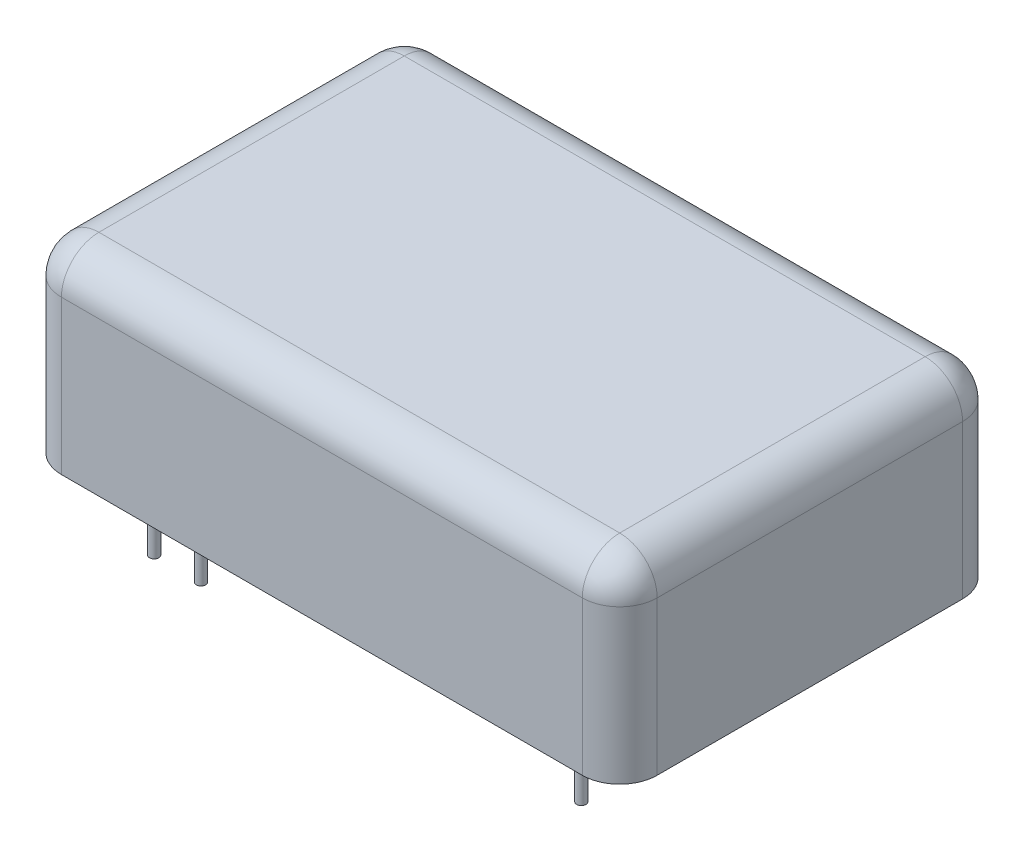
ISO-10303-21;
HEADER;
FILE_DESCRIPTION(('STEP AP214'),'2;1');
FILE_NAME('part.step','',(''),(''),'','','');
FILE_SCHEMA(('AUTOMOTIVE_DESIGN { 1 0 10303 214 1 1 1 1 }'));
ENDSEC;
DATA;
#1=APPLICATION_CONTEXT('core data for automotive mechanical design processes');
#2=APPLICATION_PROTOCOL_DEFINITION('international standard','automotive_design',2000,#1);
#3=PRODUCT_CONTEXT('',#1,'mechanical');
#4=PRODUCT('Part','Part','',(#3));
#5=PRODUCT_RELATED_PRODUCT_CATEGORY('part','',(#4));
#6=PRODUCT_DEFINITION_FORMATION('','',#4);
#7=PRODUCT_DEFINITION_CONTEXT('part definition',#1,'design');
#8=PRODUCT_DEFINITION('design','',#6,#7);
#9=PRODUCT_DEFINITION_SHAPE('','',#8);
#10=(LENGTH_UNIT() NAMED_UNIT(*) SI_UNIT(.MILLI.,.METRE.));
#11=(NAMED_UNIT(*) PLANE_ANGLE_UNIT() SI_UNIT($,.RADIAN.));
#12=(NAMED_UNIT(*) SI_UNIT($,.STERADIAN.) SOLID_ANGLE_UNIT());
#13=UNCERTAINTY_MEASURE_WITH_UNIT(LENGTH_MEASURE(1.E-05),#10,'distance_accuracy_value','');
#14=(GEOMETRIC_REPRESENTATION_CONTEXT(3) GLOBAL_UNCERTAINTY_ASSIGNED_CONTEXT((#13)) GLOBAL_UNIT_ASSIGNED_CONTEXT((#10,
#11,#12)) REPRESENTATION_CONTEXT('',''));
#15=CARTESIAN_POINT('',(0.,0.,0.));
#16=DIRECTION('',(0.,0.,1.));
#17=DIRECTION('',(1.,0.,0.));
#18=AXIS2_PLACEMENT_3D('',#15,#16,#17);
#19=CARTESIAN_POINT('',(0.,0.,0.));
#20=DIRECTION('',(0.,1.,0.));
#21=DIRECTION('',(0.,0.,1.));
#22=AXIS2_PLACEMENT_3D('',#19,#20,#21);
#23=PLANE('',#22);
#24=DIRECTION('',(0.,0.,-1.));
#25=VECTOR('',#24,1.);
#26=CARTESIAN_POINT('',(15.9,0.,-10.15));
#27=LINE('',#26,#25);
#28=CARTESIAN_POINT('',(15.9,0.,8.15));
#29=VERTEX_POINT('',#28);
#30=CARTESIAN_POINT('',(15.9,0.,-8.15000000000001));
#31=VERTEX_POINT('',#30);
#32=EDGE_CURVE('E221',#29,#31,#27,.T.);
#33=ORIENTED_EDGE('',*,*,#32,.F.);
#34=CARTESIAN_POINT('',(13.9,0.,8.15));
#35=DIRECTION('',(0.,1.,0.));
#36=DIRECTION('',(0.,0.,1.));
#37=AXIS2_PLACEMENT_3D('',#34,#35,#36);
#38=CIRCLE('',#37,2.);
#39=CARTESIAN_POINT('',(13.9,0.,10.15));
#40=VERTEX_POINT('',#39);
#41=EDGE_CURVE('E11',#29,#40,#38,.F.);
#42=ORIENTED_EDGE('',*,*,#41,.T.);
#43=DIRECTION('',(1.,0.,0.));
#44=VECTOR('',#43,1.);
#45=CARTESIAN_POINT('',(-15.9,0.,10.15));
#46=LINE('',#45,#44);
#47=CARTESIAN_POINT('',(-13.9,0.,10.15));
#48=VERTEX_POINT('',#47);
#49=EDGE_CURVE('E229',#48,#40,#46,.T.);
#50=ORIENTED_EDGE('',*,*,#49,.F.);
#51=CARTESIAN_POINT('',(-13.9,0.,8.15));
#52=DIRECTION('',(0.,1.,0.));
#53=DIRECTION('',(0.,0.,1.));
#54=AXIS2_PLACEMENT_3D('',#51,#52,#53);
#55=CIRCLE('',#54,2.);
#56=CARTESIAN_POINT('',(-15.9,0.,8.15));
#57=VERTEX_POINT('',#56);
#58=EDGE_CURVE('E172',#48,#57,#55,.F.);
#59=ORIENTED_EDGE('',*,*,#58,.T.);
#60=DIRECTION('',(0.,0.,1.));
#61=VECTOR('',#60,1.);
#62=CARTESIAN_POINT('',(-15.9,0.,-10.15));
#63=LINE('',#62,#61);
#64=CARTESIAN_POINT('',(-15.9,0.,-8.15));
#65=VERTEX_POINT('',#64);
#66=EDGE_CURVE('E226',#65,#57,#63,.T.);
#67=ORIENTED_EDGE('',*,*,#66,.F.);
#68=CARTESIAN_POINT('',(-13.9,0.,-8.15000000000001));
#69=DIRECTION('',(0.,1.,0.));
#70=DIRECTION('',(0.,0.,1.));
#71=AXIS2_PLACEMENT_3D('',#68,#69,#70);
#72=CIRCLE('',#71,2.);
#73=CARTESIAN_POINT('',(-13.9,0.,-10.15));
#74=VERTEX_POINT('',#73);
#75=EDGE_CURVE('E174',#65,#74,#72,.F.);
#76=ORIENTED_EDGE('',*,*,#75,.T.);
#77=DIRECTION('',(-1.,0.,0.));
#78=VECTOR('',#77,1.);
#79=CARTESIAN_POINT('',(-15.9,0.,-10.15));
#80=LINE('',#79,#78);
#81=CARTESIAN_POINT('',(13.9,0.,-10.15));
#82=VERTEX_POINT('',#81);
#83=EDGE_CURVE('E223',#82,#74,#80,.T.);
#84=ORIENTED_EDGE('',*,*,#83,.F.);
#85=CARTESIAN_POINT('',(13.9,0.,-8.15000000000001));
#86=DIRECTION('',(0.,1.,0.));
#87=DIRECTION('',(0.,0.,1.));
#88=AXIS2_PLACEMENT_3D('',#85,#86,#87);
#89=CIRCLE('',#88,2.);
#90=EDGE_CURVE('E43',#82,#31,#89,.F.);
#91=ORIENTED_EDGE('',*,*,#90,.T.);
#92=EDGE_LOOP('',(#33,#42,#50,#59,#67,#76,#84,#91));
#93=FACE_BOUND('',#92,.T.);
#94=CARTESIAN_POINT('',(11.3,0.,7.6));
#95=DIRECTION('',(0.,1.,0.));
#96=DIRECTION('',(0.,0.,1.));
#97=AXIS2_PLACEMENT_3D('',#94,#95,#96);
#98=CIRCLE('',#97,0.25);
#99=CARTESIAN_POINT('',(11.3,0.,7.85));
#100=VERTEX_POINT('',#99);
#101=EDGE_CURVE('E232',#100,#100,#98,.F.);
#102=ORIENTED_EDGE('',*,*,#101,.F.);
#103=EDGE_LOOP('',(#102));
#104=FACE_BOUND('',#103,.T.);
#105=CARTESIAN_POINT('',(-11.5,0.,7.6));
#106=DIRECTION('',(0.,1.,0.));
#107=DIRECTION('',(0.,0.,1.));
#108=AXIS2_PLACEMENT_3D('',#105,#106,#107);
#109=CIRCLE('',#108,0.25);
#110=CARTESIAN_POINT('',(-11.5,0.,7.85));
#111=VERTEX_POINT('',#110);
#112=EDGE_CURVE('E235',#111,#111,#109,.F.);
#113=ORIENTED_EDGE('',*,*,#112,.F.);
#114=EDGE_LOOP('',(#113));
#115=FACE_BOUND('',#114,.T.);
#116=CARTESIAN_POINT('',(-9.00000000000001,0.,7.6));
#117=DIRECTION('',(0.,1.,0.));
#118=DIRECTION('',(0.,0.,1.));
#119=AXIS2_PLACEMENT_3D('',#116,#117,#118);
#120=CIRCLE('',#119,0.25);
#121=CARTESIAN_POINT('',(-9.00000000000001,0.,7.85));
#122=VERTEX_POINT('',#121);
#123=EDGE_CURVE('E238',#122,#122,#120,.F.);
#124=ORIENTED_EDGE('',*,*,#123,.F.);
#125=EDGE_LOOP('',(#124));
#126=FACE_BOUND('',#125,.T.);
#127=CARTESIAN_POINT('',(-9.00000000000001,0.,-7.60000000000001));
#128=DIRECTION('',(0.,1.,0.));
#129=DIRECTION('',(0.,0.,1.));
#130=AXIS2_PLACEMENT_3D('',#127,#128,#129);
#131=CIRCLE('',#130,0.25);
#132=CARTESIAN_POINT('',(-9.00000000000001,0.,-7.35000000000001));
#133=VERTEX_POINT('',#132);
#134=EDGE_CURVE('E241',#133,#133,#131,.F.);
#135=ORIENTED_EDGE('',*,*,#134,.F.);
#136=EDGE_LOOP('',(#135));
#137=FACE_BOUND('',#136,.T.);
#138=CARTESIAN_POINT('',(-11.5,0.,-7.60000000000001));
#139=DIRECTION('',(0.,1.,0.));
#140=DIRECTION('',(0.,0.,1.));
#141=AXIS2_PLACEMENT_3D('',#138,#139,#140);
#142=CIRCLE('',#141,0.25);
#143=CARTESIAN_POINT('',(-11.5,0.,-7.35000000000001));
#144=VERTEX_POINT('',#143);
#145=EDGE_CURVE('E244',#144,#144,#142,.F.);
#146=ORIENTED_EDGE('',*,*,#145,.F.);
#147=EDGE_LOOP('',(#146));
#148=FACE_BOUND('',#147,.T.);
#149=CARTESIAN_POINT('',(11.3,0.,-7.60000000000001));
#150=DIRECTION('',(0.,1.,0.));
#151=DIRECTION('',(0.,0.,1.));
#152=AXIS2_PLACEMENT_3D('',#149,#150,#151);
#153=CIRCLE('',#152,0.25);
#154=CARTESIAN_POINT('',(11.3,0.,-7.35000000000001));
#155=VERTEX_POINT('',#154);
#156=EDGE_CURVE('E141',#155,#155,#153,.F.);
#157=ORIENTED_EDGE('',*,*,#156,.F.);
#158=EDGE_LOOP('',(#157));
#159=FACE_BOUND('',#158,.T.);
#160=ADVANCED_FACE('F34',(#93,#104,#115,#126,#137,#148,#159),#23,.F.);
#161=CARTESIAN_POINT('',(15.9,10.2,-10.15));
#162=DIRECTION('',(-1.,0.,0.));
#163=DIRECTION('',(0.,0.,1.));
#164=AXIS2_PLACEMENT_3D('',#161,#162,#163);
#165=PLANE('',#164);
#166=DIRECTION('',(0.,0.,-1.));
#167=VECTOR('',#166,1.);
#168=CARTESIAN_POINT('',(15.9,8.2,10.15));
#169=LINE('',#168,#167);
#170=CARTESIAN_POINT('',(15.9,8.2,-8.15000000000001));
#171=VERTEX_POINT('',#170);
#172=CARTESIAN_POINT('',(15.9,8.2,8.15));
#173=VERTEX_POINT('',#172);
#174=EDGE_CURVE('E51',#171,#173,#169,.F.);
#175=ORIENTED_EDGE('',*,*,#174,.T.);
#176=DIRECTION('',(0.,-1.,0.));
#177=VECTOR('',#176,1.);
#178=CARTESIAN_POINT('',(15.9,10.2,8.15));
#179=LINE('',#178,#177);
#180=EDGE_CURVE('E170',#173,#29,#179,.T.);
#181=ORIENTED_EDGE('',*,*,#180,.T.);
#182=ORIENTED_EDGE('',*,*,#32,.T.);
#183=DIRECTION('',(0.,-1.,0.));
#184=VECTOR('',#183,1.);
#185=CARTESIAN_POINT('',(15.9,10.2,-8.15000000000001));
#186=LINE('',#185,#184);
#187=EDGE_CURVE('E56',#31,#171,#186,.F.);
#188=ORIENTED_EDGE('',*,*,#187,.T.);
#189=EDGE_LOOP('',(#175,#181,#182,#188));
#190=FACE_BOUND('',#189,.T.);
#191=ADVANCED_FACE('F273',(#190),#165,.F.);
#192=CARTESIAN_POINT('',(-15.9,10.2,-10.15));
#193=DIRECTION('',(0.,0.,1.));
#194=DIRECTION('',(1.,0.,0.));
#195=AXIS2_PLACEMENT_3D('',#192,#193,#194);
#196=PLANE('',#195);
#197=DIRECTION('',(-1.,0.,0.));
#198=VECTOR('',#197,1.);
#199=CARTESIAN_POINT('',(15.9,8.2,-10.15));
#200=LINE('',#199,#198);
#201=CARTESIAN_POINT('',(-13.9,8.2,-10.15));
#202=VERTEX_POINT('',#201);
#203=CARTESIAN_POINT('',(13.9,8.2,-10.15));
#204=VERTEX_POINT('',#203);
#205=EDGE_CURVE('E164',#202,#204,#200,.F.);
#206=ORIENTED_EDGE('',*,*,#205,.T.);
#207=DIRECTION('',(0.,-1.,0.));
#208=VECTOR('',#207,1.);
#209=CARTESIAN_POINT('',(13.9,10.2,-10.15));
#210=LINE('',#209,#208);
#211=EDGE_CURVE('E166',#204,#82,#210,.T.);
#212=ORIENTED_EDGE('',*,*,#211,.T.);
#213=ORIENTED_EDGE('',*,*,#83,.T.);
#214=DIRECTION('',(0.,-1.,0.));
#215=VECTOR('',#214,1.);
#216=CARTESIAN_POINT('',(-13.9,10.2,-10.15));
#217=LINE('',#216,#215);
#218=EDGE_CURVE('E162',#74,#202,#217,.F.);
#219=ORIENTED_EDGE('',*,*,#218,.T.);
#220=EDGE_LOOP('',(#206,#212,#213,#219));
#221=FACE_BOUND('',#220,.T.);
#222=ADVANCED_FACE('F296',(#221),#196,.F.);
#223=CARTESIAN_POINT('',(-15.9,10.2,-10.15));
#224=DIRECTION('',(1.,0.,0.));
#225=DIRECTION('',(0.,0.,-1.));
#226=AXIS2_PLACEMENT_3D('',#223,#224,#225);
#227=PLANE('',#226);
#228=DIRECTION('',(0.,0.,1.));
#229=VECTOR('',#228,1.);
#230=CARTESIAN_POINT('',(-15.9,8.2,-10.15));
#231=LINE('',#230,#229);
#232=CARTESIAN_POINT('',(-15.9,8.2,8.15));
#233=VERTEX_POINT('',#232);
#234=CARTESIAN_POINT('',(-15.9,8.2,-8.15));
#235=VERTEX_POINT('',#234);
#236=EDGE_CURVE('E158',#233,#235,#231,.F.);
#237=ORIENTED_EDGE('',*,*,#236,.T.);
#238=DIRECTION('',(0.,-1.,0.));
#239=VECTOR('',#238,1.);
#240=CARTESIAN_POINT('',(-15.9,10.2,-8.15));
#241=LINE('',#240,#239);
#242=EDGE_CURVE('E160',#235,#65,#241,.T.);
#243=ORIENTED_EDGE('',*,*,#242,.T.);
#244=ORIENTED_EDGE('',*,*,#66,.T.);
#245=DIRECTION('',(0.,-1.,0.));
#246=VECTOR('',#245,1.);
#247=CARTESIAN_POINT('',(-15.9,10.2,8.15));
#248=LINE('',#247,#246);
#249=EDGE_CURVE('E156',#57,#233,#248,.F.);
#250=ORIENTED_EDGE('',*,*,#249,.T.);
#251=EDGE_LOOP('',(#237,#243,#244,#250));
#252=FACE_BOUND('',#251,.T.);
#253=ADVANCED_FACE('F303',(#252),#227,.F.);
#254=CARTESIAN_POINT('',(-15.9,10.2,10.15));
#255=DIRECTION('',(0.,0.,-1.));
#256=DIRECTION('',(-1.,0.,0.));
#257=AXIS2_PLACEMENT_3D('',#254,#255,#256);
#258=PLANE('',#257);
#259=ORIENTED_EDGE('',*,*,#49,.T.);
#260=DIRECTION('',(0.,-1.,0.));
#261=VECTOR('',#260,1.);
#262=CARTESIAN_POINT('',(13.9,10.2,10.15));
#263=LINE('',#262,#261);
#264=CARTESIAN_POINT('',(13.9,8.2,10.15));
#265=VERTEX_POINT('',#264);
#266=EDGE_CURVE('E154',#40,#265,#263,.F.);
#267=ORIENTED_EDGE('',*,*,#266,.T.);
#268=DIRECTION('',(1.,0.,0.));
#269=VECTOR('',#268,1.);
#270=CARTESIAN_POINT('',(-15.9,8.2,10.15));
#271=LINE('',#270,#269);
#272=CARTESIAN_POINT('',(-13.9,8.2,10.15));
#273=VERTEX_POINT('',#272);
#274=EDGE_CURVE('E119',#265,#273,#271,.F.);
#275=ORIENTED_EDGE('',*,*,#274,.T.);
#276=DIRECTION('',(0.,-1.,0.));
#277=VECTOR('',#276,1.);
#278=CARTESIAN_POINT('',(-13.9,10.2,10.15));
#279=LINE('',#278,#277);
#280=EDGE_CURVE('E147',#273,#48,#279,.T.);
#281=ORIENTED_EDGE('',*,*,#280,.T.);
#282=EDGE_LOOP('',(#259,#267,#275,#281));
#283=FACE_BOUND('',#282,.T.);
#284=ADVANCED_FACE('F267',(#283),#258,.F.);
#285=CARTESIAN_POINT('',(0.,10.2,0.));
#286=DIRECTION('',(0.,1.,0.));
#287=DIRECTION('',(0.,0.,1.));
#288=AXIS2_PLACEMENT_3D('',#285,#286,#287);
#289=PLANE('',#288);
#290=DIRECTION('',(0.,0.,1.));
#291=VECTOR('',#290,1.);
#292=CARTESIAN_POINT('',(-13.9,10.2,10.15));
#293=LINE('',#292,#291);
#294=CARTESIAN_POINT('',(-13.9,10.2,-8.15000000000001));
#295=VERTEX_POINT('',#294);
#296=CARTESIAN_POINT('',(-13.9,10.2,8.15));
#297=VERTEX_POINT('',#296);
#298=EDGE_CURVE('E145',#295,#297,#293,.T.);
#299=ORIENTED_EDGE('',*,*,#298,.T.);
#300=DIRECTION('',(1.,0.,0.));
#301=VECTOR('',#300,1.);
#302=CARTESIAN_POINT('',(15.9,10.2,8.15));
#303=LINE('',#302,#301);
#304=CARTESIAN_POINT('',(13.9,10.2,8.15));
#305=VERTEX_POINT('',#304);
#306=EDGE_CURVE('E117',#297,#305,#303,.T.);
#307=ORIENTED_EDGE('',*,*,#306,.T.);
#308=DIRECTION('',(0.,0.,-1.));
#309=VECTOR('',#308,1.);
#310=CARTESIAN_POINT('',(13.9,10.2,-10.15));
#311=LINE('',#310,#309);
#312=CARTESIAN_POINT('',(13.9,10.2,-8.15000000000001));
#313=VERTEX_POINT('',#312);
#314=EDGE_CURVE('E134',#305,#313,#311,.T.);
#315=ORIENTED_EDGE('',*,*,#314,.T.);
#316=DIRECTION('',(-1.,0.,0.));
#317=VECTOR('',#316,1.);
#318=CARTESIAN_POINT('',(-15.9,10.2,-8.15000000000001));
#319=LINE('',#318,#317);
#320=EDGE_CURVE('E140',#313,#295,#319,.T.);
#321=ORIENTED_EDGE('',*,*,#320,.T.);
#322=EDGE_LOOP('',(#299,#307,#315,#321));
#323=FACE_BOUND('',#322,.T.);
#324=ADVANCED_FACE('F143',(#323),#289,.T.);
#325=CARTESIAN_POINT('',(11.3,-3.8,7.6));
#326=DIRECTION('',(0.,1.,0.));
#327=DIRECTION('',(0.,0.,1.));
#328=AXIS2_PLACEMENT_3D('',#325,#326,#327);
#329=CYLINDRICAL_SURFACE('',#328,0.25);
#330=CARTESIAN_POINT('',(11.3,-3.8,7.6));
#331=DIRECTION('',(0.,-1.,0.));
#332=DIRECTION('',(0.,0.,-1.));
#333=AXIS2_PLACEMENT_3D('',#330,#331,#332);
#334=CIRCLE('',#333,0.25);
#335=CARTESIAN_POINT('',(11.3,-3.8,7.35));
#336=VERTEX_POINT('',#335);
#337=EDGE_CURVE('E218',#336,#336,#334,.T.);
#338=ORIENTED_EDGE('',*,*,#337,.F.);
#339=EDGE_LOOP('',(#338));
#340=FACE_BOUND('',#339,.T.);
#341=ORIENTED_EDGE('',*,*,#101,.T.);
#342=EDGE_LOOP('',(#341));
#343=FACE_BOUND('',#342,.T.);
#344=ADVANCED_FACE('F489',(#340,#343),#329,.T.);
#345=CARTESIAN_POINT('',(11.3,-3.8,7.6));
#346=DIRECTION('',(0.,-1.,0.));
#347=DIRECTION('',(0.,0.,-1.));
#348=AXIS2_PLACEMENT_3D('',#345,#346,#347);
#349=PLANE('',#348);
#350=ORIENTED_EDGE('',*,*,#337,.T.);
#351=EDGE_LOOP('',(#350));
#352=FACE_BOUND('',#351,.T.);
#353=ADVANCED_FACE('F480',(#352),#349,.T.);
#354=CARTESIAN_POINT('',(-11.5,-3.8,7.6));
#355=DIRECTION('',(0.,1.,0.));
#356=DIRECTION('',(0.,0.,1.));
#357=AXIS2_PLACEMENT_3D('',#354,#355,#356);
#358=CYLINDRICAL_SURFACE('',#357,0.25);
#359=CARTESIAN_POINT('',(-11.5,-3.8,7.6));
#360=DIRECTION('',(0.,-1.,0.));
#361=DIRECTION('',(0.,0.,-1.));
#362=AXIS2_PLACEMENT_3D('',#359,#360,#361);
#363=CIRCLE('',#362,0.25);
#364=CARTESIAN_POINT('',(-11.5,-3.8,7.35));
#365=VERTEX_POINT('',#364);
#366=EDGE_CURVE('E215',#365,#365,#363,.T.);
#367=ORIENTED_EDGE('',*,*,#366,.F.);
#368=EDGE_LOOP('',(#367));
#369=FACE_BOUND('',#368,.T.);
#370=ORIENTED_EDGE('',*,*,#112,.T.);
#371=EDGE_LOOP('',(#370));
#372=FACE_BOUND('',#371,.T.);
#373=ADVANCED_FACE('F471',(#369,#372),#358,.T.);
#374=CARTESIAN_POINT('',(-11.5,-3.8,7.6));
#375=DIRECTION('',(0.,-1.,0.));
#376=DIRECTION('',(0.,0.,-1.));
#377=AXIS2_PLACEMENT_3D('',#374,#375,#376);
#378=PLANE('',#377);
#379=ORIENTED_EDGE('',*,*,#366,.T.);
#380=EDGE_LOOP('',(#379));
#381=FACE_BOUND('',#380,.T.);
#382=ADVANCED_FACE('F462',(#381),#378,.T.);
#383=CARTESIAN_POINT('',(-9.00000000000001,-3.8,7.6));
#384=DIRECTION('',(0.,1.,0.));
#385=DIRECTION('',(0.,0.,1.));
#386=AXIS2_PLACEMENT_3D('',#383,#384,#385);
#387=CYLINDRICAL_SURFACE('',#386,0.25);
#388=CARTESIAN_POINT('',(-9.00000000000001,-3.8,7.6));
#389=DIRECTION('',(0.,-1.,0.));
#390=DIRECTION('',(0.,0.,-1.));
#391=AXIS2_PLACEMENT_3D('',#388,#389,#390);
#392=CIRCLE('',#391,0.25);
#393=CARTESIAN_POINT('',(-9.00000000000001,-3.8,7.35));
#394=VERTEX_POINT('',#393);
#395=EDGE_CURVE('E212',#394,#394,#392,.T.);
#396=ORIENTED_EDGE('',*,*,#395,.F.);
#397=EDGE_LOOP('',(#396));
#398=FACE_BOUND('',#397,.T.);
#399=ORIENTED_EDGE('',*,*,#123,.T.);
#400=EDGE_LOOP('',(#399));
#401=FACE_BOUND('',#400,.T.);
#402=ADVANCED_FACE('F453',(#398,#401),#387,.T.);
#403=CARTESIAN_POINT('',(-9.00000000000001,-3.8,7.6));
#404=DIRECTION('',(0.,-1.,0.));
#405=DIRECTION('',(0.,0.,-1.));
#406=AXIS2_PLACEMENT_3D('',#403,#404,#405);
#407=PLANE('',#406);
#408=ORIENTED_EDGE('',*,*,#395,.T.);
#409=EDGE_LOOP('',(#408));
#410=FACE_BOUND('',#409,.T.);
#411=ADVANCED_FACE('F444',(#410),#407,.T.);
#412=CARTESIAN_POINT('',(-9.00000000000001,-3.8,-7.60000000000001));
#413=DIRECTION('',(0.,1.,0.));
#414=DIRECTION('',(0.,0.,1.));
#415=AXIS2_PLACEMENT_3D('',#412,#413,#414);
#416=CYLINDRICAL_SURFACE('',#415,0.25);
#417=CARTESIAN_POINT('',(-9.00000000000001,-3.8,-7.60000000000001));
#418=DIRECTION('',(0.,-1.,0.));
#419=DIRECTION('',(0.,0.,1.));
#420=AXIS2_PLACEMENT_3D('',#417,#418,#419);
#421=CIRCLE('',#420,0.25);
#422=CARTESIAN_POINT('',(-9.00000000000001,-3.8,-7.35000000000001));
#423=VERTEX_POINT('',#422);
#424=EDGE_CURVE('E207',#423,#423,#421,.T.);
#425=ORIENTED_EDGE('',*,*,#424,.F.);
#426=EDGE_LOOP('',(#425));
#427=FACE_BOUND('',#426,.T.);
#428=ORIENTED_EDGE('',*,*,#134,.T.);
#429=EDGE_LOOP('',(#428));
#430=FACE_BOUND('',#429,.T.);
#431=ADVANCED_FACE('F435',(#427,#430),#416,.T.);
#432=CARTESIAN_POINT('',(-9.00000000000001,-3.8,-7.60000000000001));
#433=DIRECTION('',(0.,1.,0.));
#434=DIRECTION('',(0.,0.,1.));
#435=AXIS2_PLACEMENT_3D('',#432,#433,#434);
#436=PLANE('',#435);
#437=ORIENTED_EDGE('',*,*,#424,.T.);
#438=EDGE_LOOP('',(#437));
#439=FACE_BOUND('',#438,.T.);
#440=ADVANCED_FACE('F426',(#439),#436,.F.);
#441=CARTESIAN_POINT('',(-11.5,-3.8,-7.60000000000001));
#442=DIRECTION('',(0.,1.,0.));
#443=DIRECTION('',(0.,0.,1.));
#444=AXIS2_PLACEMENT_3D('',#441,#442,#443);
#445=CYLINDRICAL_SURFACE('',#444,0.25);
#446=CARTESIAN_POINT('',(-11.5,-3.8,-7.60000000000001));
#447=DIRECTION('',(0.,-1.,0.));
#448=DIRECTION('',(0.,0.,1.));
#449=AXIS2_PLACEMENT_3D('',#446,#447,#448);
#450=CIRCLE('',#449,0.25);
#451=CARTESIAN_POINT('',(-11.5,-3.8,-7.35000000000001));
#452=VERTEX_POINT('',#451);
#453=EDGE_CURVE('E202',#452,#452,#450,.T.);
#454=ORIENTED_EDGE('',*,*,#453,.F.);
#455=EDGE_LOOP('',(#454));
#456=FACE_BOUND('',#455,.T.);
#457=ORIENTED_EDGE('',*,*,#145,.T.);
#458=EDGE_LOOP('',(#457));
#459=FACE_BOUND('',#458,.T.);
#460=ADVANCED_FACE('F417',(#456,#459),#445,.T.);
#461=CARTESIAN_POINT('',(-11.5,-3.8,-7.60000000000001));
#462=DIRECTION('',(0.,1.,0.));
#463=DIRECTION('',(0.,0.,1.));
#464=AXIS2_PLACEMENT_3D('',#461,#462,#463);
#465=PLANE('',#464);
#466=ORIENTED_EDGE('',*,*,#453,.T.);
#467=EDGE_LOOP('',(#466));
#468=FACE_BOUND('',#467,.T.);
#469=ADVANCED_FACE('F408',(#468),#465,.F.);
#470=CARTESIAN_POINT('',(11.3,-3.8,-7.60000000000001));
#471=DIRECTION('',(0.,1.,0.));
#472=DIRECTION('',(0.,0.,1.));
#473=AXIS2_PLACEMENT_3D('',#470,#471,#472);
#474=CYLINDRICAL_SURFACE('',#473,0.25);
#475=CARTESIAN_POINT('',(11.3,-3.8,-7.60000000000001));
#476=DIRECTION('',(0.,-1.,0.));
#477=DIRECTION('',(0.,0.,1.));
#478=AXIS2_PLACEMENT_3D('',#475,#476,#477);
#479=CIRCLE('',#478,0.25);
#480=CARTESIAN_POINT('',(11.3,-3.8,-7.35000000000001));
#481=VERTEX_POINT('',#480);
#482=EDGE_CURVE('E199',#481,#481,#479,.T.);
#483=ORIENTED_EDGE('',*,*,#482,.F.);
#484=EDGE_LOOP('',(#483));
#485=FACE_BOUND('',#484,.T.);
#486=ORIENTED_EDGE('',*,*,#156,.T.);
#487=EDGE_LOOP('',(#486));
#488=FACE_BOUND('',#487,.T.);
#489=ADVANCED_FACE('F400',(#485,#488),#474,.T.);
#490=CARTESIAN_POINT('',(11.3,-3.8,-7.60000000000001));
#491=DIRECTION('',(0.,1.,0.));
#492=DIRECTION('',(0.,0.,1.));
#493=AXIS2_PLACEMENT_3D('',#490,#491,#492);
#494=PLANE('',#493);
#495=ORIENTED_EDGE('',*,*,#482,.T.);
#496=EDGE_LOOP('',(#495));
#497=FACE_BOUND('',#496,.T.);
#498=ADVANCED_FACE('F391',(#497),#494,.F.);
#499=CARTESIAN_POINT('',(-13.9,10.2,-8.15000000000001));
#500=DIRECTION('',(0.,-1.,0.));
#501=DIRECTION('',(0.,0.,-1.));
#502=AXIS2_PLACEMENT_3D('',#499,#500,#501);
#503=CYLINDRICAL_SURFACE('',#502,2.);
#504=ORIENTED_EDGE('',*,*,#75,.F.);
#505=ORIENTED_EDGE('',*,*,#242,.F.);
#506=CARTESIAN_POINT('',(-13.9,8.2,-8.15000000000001));
#507=DIRECTION('',(0.,1.,0.));
#508=DIRECTION('',(0.,0.,1.));
#509=AXIS2_PLACEMENT_3D('',#506,#507,#508);
#510=CIRCLE('',#509,2.);
#511=EDGE_CURVE('E38',#202,#235,#510,.T.);
#512=ORIENTED_EDGE('',*,*,#511,.F.);
#513=ORIENTED_EDGE('',*,*,#218,.F.);
#514=EDGE_LOOP('',(#504,#505,#512,#513));
#515=FACE_BOUND('',#514,.T.);
#516=ADVANCED_FACE('F36',(#515),#503,.T.);
#517=CARTESIAN_POINT('',(0.,8.2,-8.15000000000001));
#518=DIRECTION('',(1.,0.,0.));
#519=DIRECTION('',(0.,0.,-1.));
#520=AXIS2_PLACEMENT_3D('',#517,#518,#519);
#521=CYLINDRICAL_SURFACE('',#520,2.);
#522=CARTESIAN_POINT('',(13.9,8.2,-8.15000000000001));
#523=DIRECTION('',(1.,0.,0.));
#524=DIRECTION('',(0.,1.,0.));
#525=AXIS2_PLACEMENT_3D('',#522,#523,#524);
#526=CIRCLE('',#525,2.);
#527=EDGE_CURVE('E191',#204,#313,#526,.T.);
#528=ORIENTED_EDGE('',*,*,#527,.F.);
#529=ORIENTED_EDGE('',*,*,#205,.F.);
#530=CARTESIAN_POINT('',(-13.9,8.2,-8.15000000000001));
#531=DIRECTION('',(-1.,0.,0.));
#532=DIRECTION('',(0.,0.,1.));
#533=AXIS2_PLACEMENT_3D('',#530,#531,#532);
#534=CIRCLE('',#533,2.);
#535=EDGE_CURVE('E193',#295,#202,#534,.T.);
#536=ORIENTED_EDGE('',*,*,#535,.F.);
#537=ORIENTED_EDGE('',*,*,#320,.F.);
#538=EDGE_LOOP('',(#528,#529,#536,#537));
#539=FACE_BOUND('',#538,.T.);
#540=ADVANCED_FACE('F251',(#539),#521,.T.);
#541=CARTESIAN_POINT('',(13.9,10.2,-8.15000000000001));
#542=DIRECTION('',(0.,-1.,0.));
#543=DIRECTION('',(0.,0.,-1.));
#544=AXIS2_PLACEMENT_3D('',#541,#542,#543);
#545=CYLINDRICAL_SURFACE('',#544,2.);
#546=ORIENTED_EDGE('',*,*,#90,.F.);
#547=ORIENTED_EDGE('',*,*,#211,.F.);
#548=CARTESIAN_POINT('',(13.9,8.2,-8.15000000000001));
#549=DIRECTION('',(0.,1.,0.));
#550=DIRECTION('',(0.,0.,1.));
#551=AXIS2_PLACEMENT_3D('',#548,#549,#550);
#552=CIRCLE('',#551,2.);
#553=EDGE_CURVE('E188',#171,#204,#552,.T.);
#554=ORIENTED_EDGE('',*,*,#553,.F.);
#555=ORIENTED_EDGE('',*,*,#187,.F.);
#556=EDGE_LOOP('',(#546,#547,#554,#555));
#557=FACE_BOUND('',#556,.T.);
#558=ADVANCED_FACE('F280',(#557),#545,.T.);
#559=CARTESIAN_POINT('',(-13.9,8.2,-8.15000000000001));
#560=DIRECTION('',(0.,0.,1.));
#561=DIRECTION('',(1.,0.,0.));
#562=AXIS2_PLACEMENT_3D('',#559,#560,#561);
#563=SPHERICAL_SURFACE('',#562,2.);
#564=ORIENTED_EDGE('',*,*,#535,.T.);
#565=ORIENTED_EDGE('',*,*,#511,.T.);
#566=CARTESIAN_POINT('',(-13.9,8.2,-8.15000000000001));
#567=DIRECTION('',(0.,0.,-1.));
#568=DIRECTION('',(-1.,0.,0.));
#569=AXIS2_PLACEMENT_3D('',#566,#567,#568);
#570=CIRCLE('',#569,2.);
#571=EDGE_CURVE('E185',#295,#235,#570,.F.);
#572=ORIENTED_EDGE('',*,*,#571,.F.);
#573=EDGE_LOOP('',(#564,#565,#572));
#574=FACE_BOUND('',#573,.T.);
#575=ADVANCED_FACE('F252',(#574),#563,.T.);
#576=CARTESIAN_POINT('',(13.9,8.2,-8.15000000000001));
#577=DIRECTION('',(0.,0.,1.));
#578=DIRECTION('',(1.,0.,0.));
#579=AXIS2_PLACEMENT_3D('',#576,#577,#578);
#580=SPHERICAL_SURFACE('',#579,2.);
#581=ORIENTED_EDGE('',*,*,#553,.T.);
#582=ORIENTED_EDGE('',*,*,#527,.T.);
#583=CARTESIAN_POINT('',(13.9,8.2,-8.15000000000001));
#584=DIRECTION('',(0.,0.,-1.));
#585=DIRECTION('',(-1.,0.,0.));
#586=AXIS2_PLACEMENT_3D('',#583,#584,#585);
#587=CIRCLE('',#586,2.);
#588=EDGE_CURVE('E137',#171,#313,#587,.F.);
#589=ORIENTED_EDGE('',*,*,#588,.F.);
#590=EDGE_LOOP('',(#581,#582,#589));
#591=FACE_BOUND('',#590,.T.);
#592=ADVANCED_FACE('F282',(#591),#580,.T.);
#593=CARTESIAN_POINT('',(-13.9,10.2,8.15));
#594=DIRECTION('',(0.,-1.,0.));
#595=DIRECTION('',(0.,0.,-1.));
#596=AXIS2_PLACEMENT_3D('',#593,#594,#595);
#597=CYLINDRICAL_SURFACE('',#596,2.);
#598=ORIENTED_EDGE('',*,*,#58,.F.);
#599=ORIENTED_EDGE('',*,*,#280,.F.);
#600=CARTESIAN_POINT('',(-13.9,8.2,8.15));
#601=DIRECTION('',(0.,1.,0.));
#602=DIRECTION('',(0.,0.,1.));
#603=AXIS2_PLACEMENT_3D('',#600,#601,#602);
#604=CIRCLE('',#603,2.);
#605=EDGE_CURVE('E181',#233,#273,#604,.T.);
#606=ORIENTED_EDGE('',*,*,#605,.F.);
#607=ORIENTED_EDGE('',*,*,#249,.F.);
#608=EDGE_LOOP('',(#598,#599,#606,#607));
#609=FACE_BOUND('',#608,.T.);
#610=ADVANCED_FACE('F264',(#609),#597,.T.);
#611=CARTESIAN_POINT('',(-13.9,8.2,0.));
#612=DIRECTION('',(0.,0.,-1.));
#613=DIRECTION('',(-1.,0.,0.));
#614=AXIS2_PLACEMENT_3D('',#611,#612,#613);
#615=CYLINDRICAL_SURFACE('',#614,2.);
#616=ORIENTED_EDGE('',*,*,#571,.T.);
#617=ORIENTED_EDGE('',*,*,#236,.F.);
#618=CARTESIAN_POINT('',(-13.9,8.2,8.15));
#619=DIRECTION('',(0.,0.,1.));
#620=DIRECTION('',(1.,0.,0.));
#621=AXIS2_PLACEMENT_3D('',#618,#619,#620);
#622=CIRCLE('',#621,2.);
#623=EDGE_CURVE('E131',#297,#233,#622,.T.);
#624=ORIENTED_EDGE('',*,*,#623,.F.);
#625=ORIENTED_EDGE('',*,*,#298,.F.);
#626=EDGE_LOOP('',(#616,#617,#624,#625));
#627=FACE_BOUND('',#626,.T.);
#628=ADVANCED_FACE('F255',(#627),#615,.T.);
#629=CARTESIAN_POINT('',(13.9,8.2,0.));
#630=DIRECTION('',(0.,0.,1.));
#631=DIRECTION('',(1.,0.,0.));
#632=AXIS2_PLACEMENT_3D('',#629,#630,#631);
#633=CYLINDRICAL_SURFACE('',#632,2.);
#634=ORIENTED_EDGE('',*,*,#588,.T.);
#635=ORIENTED_EDGE('',*,*,#314,.F.);
#636=CARTESIAN_POINT('',(13.9,8.2,8.15));
#637=DIRECTION('',(0.,0.,1.));
#638=DIRECTION('',(0.,-1.,0.));
#639=AXIS2_PLACEMENT_3D('',#636,#637,#638);
#640=CIRCLE('',#639,2.);
#641=EDGE_CURVE('E125',#173,#305,#640,.T.);
#642=ORIENTED_EDGE('',*,*,#641,.F.);
#643=ORIENTED_EDGE('',*,*,#174,.F.);
#644=EDGE_LOOP('',(#634,#635,#642,#643));
#645=FACE_BOUND('',#644,.T.);
#646=ADVANCED_FACE('F135',(#645),#633,.T.);
#647=CARTESIAN_POINT('',(13.9,10.2,8.15));
#648=DIRECTION('',(0.,-1.,0.));
#649=DIRECTION('',(0.,0.,-1.));
#650=AXIS2_PLACEMENT_3D('',#647,#648,#649);
#651=CYLINDRICAL_SURFACE('',#650,2.);
#652=ORIENTED_EDGE('',*,*,#41,.F.);
#653=ORIENTED_EDGE('',*,*,#180,.F.);
#654=CARTESIAN_POINT('',(13.9,8.2,8.15));
#655=DIRECTION('',(0.,1.,0.));
#656=DIRECTION('',(0.,0.,1.));
#657=AXIS2_PLACEMENT_3D('',#654,#655,#656);
#658=CIRCLE('',#657,2.);
#659=EDGE_CURVE('E129',#265,#173,#658,.T.);
#660=ORIENTED_EDGE('',*,*,#659,.F.);
#661=ORIENTED_EDGE('',*,*,#266,.F.);
#662=EDGE_LOOP('',(#652,#653,#660,#661));
#663=FACE_BOUND('',#662,.T.);
#664=ADVANCED_FACE('F271',(#663),#651,.T.);
#665=CARTESIAN_POINT('',(-13.9,8.2,8.15));
#666=DIRECTION('',(0.,0.,1.));
#667=DIRECTION('',(1.,0.,0.));
#668=AXIS2_PLACEMENT_3D('',#665,#666,#667);
#669=SPHERICAL_SURFACE('',#668,2.);
#670=ORIENTED_EDGE('',*,*,#623,.T.);
#671=ORIENTED_EDGE('',*,*,#605,.T.);
#672=CARTESIAN_POINT('',(-13.9,8.2,8.15));
#673=DIRECTION('',(-1.,0.,0.));
#674=DIRECTION('',(0.,0.,1.));
#675=AXIS2_PLACEMENT_3D('',#672,#673,#674);
#676=CIRCLE('',#675,2.);
#677=EDGE_CURVE('E122',#297,#273,#676,.F.);
#678=ORIENTED_EDGE('',*,*,#677,.F.);
#679=EDGE_LOOP('',(#670,#671,#678));
#680=FACE_BOUND('',#679,.T.);
#681=ADVANCED_FACE('F259',(#680),#669,.T.);
#682=CARTESIAN_POINT('',(13.9,8.2,8.15));
#683=DIRECTION('',(0.,0.,1.));
#684=DIRECTION('',(1.,0.,0.));
#685=AXIS2_PLACEMENT_3D('',#682,#683,#684);
#686=SPHERICAL_SURFACE('',#685,2.);
#687=ORIENTED_EDGE('',*,*,#659,.T.);
#688=ORIENTED_EDGE('',*,*,#641,.T.);
#689=CARTESIAN_POINT('',(13.9,8.2,8.15));
#690=DIRECTION('',(1.,0.,0.));
#691=DIRECTION('',(0.,0.,-1.));
#692=AXIS2_PLACEMENT_3D('',#689,#690,#691);
#693=CIRCLE('',#692,2.);
#694=EDGE_CURVE('E113',#265,#305,#693,.F.);
#695=ORIENTED_EDGE('',*,*,#694,.F.);
#696=EDGE_LOOP('',(#687,#688,#695));
#697=FACE_BOUND('',#696,.T.);
#698=ADVANCED_FACE('F127',(#697),#686,.T.);
#699=CARTESIAN_POINT('',(0.,8.2,8.15));
#700=DIRECTION('',(-1.,0.,0.));
#701=DIRECTION('',(0.,0.,1.));
#702=AXIS2_PLACEMENT_3D('',#699,#700,#701);
#703=CYLINDRICAL_SURFACE('',#702,2.);
#704=ORIENTED_EDGE('',*,*,#677,.T.);
#705=ORIENTED_EDGE('',*,*,#274,.F.);
#706=ORIENTED_EDGE('',*,*,#694,.T.);
#707=ORIENTED_EDGE('',*,*,#306,.F.);
#708=EDGE_LOOP('',(#704,#705,#706,#707));
#709=FACE_BOUND('',#708,.T.);
#710=ADVANCED_FACE('F115',(#709),#703,.T.);
#711=CLOSED_SHELL('',(#160,#191,#222,#253,#284,#324,#344,#353,#373,#382,#402,#411,#431,#440,
#460,#469,#489,#498,#516,#540,#558,#575,#592,#610,#628,#646,#664,#681,#698,#710));
#712=MANIFOLD_SOLID_BREP('B2',#711);
#713=ADVANCED_BREP_SHAPE_REPRESENTATION('',(#18,#712),#14);
#714=SHAPE_DEFINITION_REPRESENTATION(#9,#713);
ENDSEC;
END-ISO-10303-21;
